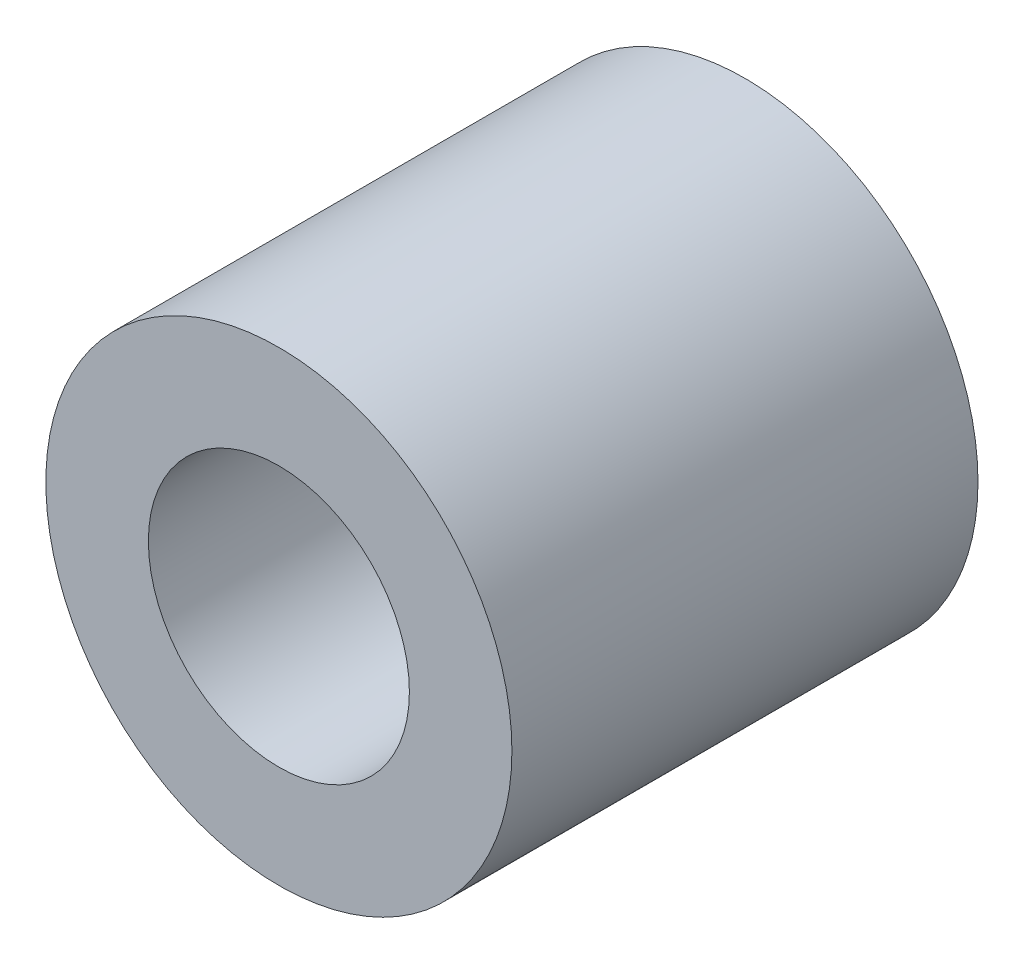
ISO-10303-21;
HEADER;
FILE_DESCRIPTION(('STEP AP214'),'2;1');
FILE_NAME('part.step','',(''),(''),'','','');
FILE_SCHEMA(('AUTOMOTIVE_DESIGN { 1 0 10303 214 1 1 1 1 }'));
ENDSEC;
DATA;
#1=APPLICATION_CONTEXT('core data for automotive mechanical design processes');
#2=APPLICATION_PROTOCOL_DEFINITION('international standard','automotive_design',2000,#1);
#3=PRODUCT_CONTEXT('',#1,'mechanical');
#4=PRODUCT('Part','Part','',(#3));
#5=PRODUCT_RELATED_PRODUCT_CATEGORY('part','',(#4));
#6=PRODUCT_DEFINITION_FORMATION('','',#4);
#7=PRODUCT_DEFINITION_CONTEXT('part definition',#1,'design');
#8=PRODUCT_DEFINITION('design','',#6,#7);
#9=PRODUCT_DEFINITION_SHAPE('','',#8);
#10=(LENGTH_UNIT() NAMED_UNIT(*) SI_UNIT(.MILLI.,.METRE.));
#11=(NAMED_UNIT(*) PLANE_ANGLE_UNIT() SI_UNIT($,.RADIAN.));
#12=(NAMED_UNIT(*) SI_UNIT($,.STERADIAN.) SOLID_ANGLE_UNIT());
#13=UNCERTAINTY_MEASURE_WITH_UNIT(LENGTH_MEASURE(1.E-05),#10,'distance_accuracy_value','');
#14=(GEOMETRIC_REPRESENTATION_CONTEXT(3) GLOBAL_UNCERTAINTY_ASSIGNED_CONTEXT((#13)) GLOBAL_UNIT_ASSIGNED_CONTEXT((#10,
#11,#12)) REPRESENTATION_CONTEXT('',''));
#15=CARTESIAN_POINT('',(0.,0.,0.));
#16=DIRECTION('',(0.,0.,1.));
#17=DIRECTION('',(1.,0.,0.));
#18=AXIS2_PLACEMENT_3D('',#15,#16,#17);
#19=CARTESIAN_POINT('',(0.,0.,3.175));
#20=DIRECTION('',(0.,0.,1.));
#21=DIRECTION('',(1.,0.,0.));
#22=AXIS2_PLACEMENT_3D('',#19,#20,#21);
#23=PLANE('',#22);
#24=CARTESIAN_POINT('',(0.,0.,3.175));
#25=DIRECTION('',(0.,0.,1.));
#26=DIRECTION('',(1.,0.,0.));
#27=AXIS2_PLACEMENT_3D('',#24,#25,#26);
#28=CIRCLE('',#27,3.175);
#29=CARTESIAN_POINT('',(3.175,0.,3.175));
#30=VERTEX_POINT('',#29);
#31=EDGE_CURVE('E10',#30,#30,#28,.T.);
#32=ORIENTED_EDGE('',*,*,#31,.T.);
#33=EDGE_LOOP('',(#32));
#34=FACE_BOUND('',#33,.T.);
#35=CARTESIAN_POINT('',(0.,0.,3.175));
#36=DIRECTION('',(0.,0.,1.));
#37=DIRECTION('',(1.,0.,0.));
#38=AXIS2_PLACEMENT_3D('',#35,#36,#37);
#39=CIRCLE('',#38,1.778);
#40=CARTESIAN_POINT('',(1.778,0.,3.175));
#41=VERTEX_POINT('',#40);
#42=EDGE_CURVE('E43',#41,#41,#39,.T.);
#43=ORIENTED_EDGE('',*,*,#42,.F.);
#44=EDGE_LOOP('',(#43));
#45=FACE_BOUND('',#44,.T.);
#46=ADVANCED_FACE('F32',(#34,#45),#23,.T.);
#47=CARTESIAN_POINT('',(0.,0.,-3.175));
#48=DIRECTION('',(0.,0.,1.));
#49=DIRECTION('',(1.,0.,0.));
#50=AXIS2_PLACEMENT_3D('',#47,#48,#49);
#51=PLANE('',#50);
#52=CARTESIAN_POINT('',(0.,0.,-3.175));
#53=DIRECTION('',(0.,0.,1.));
#54=DIRECTION('',(1.,0.,0.));
#55=AXIS2_PLACEMENT_3D('',#52,#53,#54);
#56=CIRCLE('',#55,3.175);
#57=CARTESIAN_POINT('',(3.175,0.,-3.175));
#58=VERTEX_POINT('',#57);
#59=EDGE_CURVE('E36',#58,#58,#56,.T.);
#60=ORIENTED_EDGE('',*,*,#59,.F.);
#61=EDGE_LOOP('',(#60));
#62=FACE_BOUND('',#61,.T.);
#63=CARTESIAN_POINT('',(0.,0.,-3.175));
#64=DIRECTION('',(0.,0.,1.));
#65=DIRECTION('',(1.,0.,0.));
#66=AXIS2_PLACEMENT_3D('',#63,#64,#65);
#67=CIRCLE('',#66,1.778);
#68=CARTESIAN_POINT('',(1.778,0.,-3.175));
#69=VERTEX_POINT('',#68);
#70=EDGE_CURVE('E45',#69,#69,#67,.T.);
#71=ORIENTED_EDGE('',*,*,#70,.T.);
#72=EDGE_LOOP('',(#71));
#73=FACE_BOUND('',#72,.T.);
#74=ADVANCED_FACE('F55',(#62,#73),#51,.F.);
#75=CARTESIAN_POINT('',(0.,0.,3.175));
#76=DIRECTION('',(0.,0.,-1.));
#77=DIRECTION('',(-1.,0.,0.));
#78=AXIS2_PLACEMENT_3D('',#75,#76,#77);
#79=CYLINDRICAL_SURFACE('',#78,3.175);
#80=ORIENTED_EDGE('',*,*,#31,.F.);
#81=EDGE_LOOP('',(#80));
#82=FACE_BOUND('',#81,.T.);
#83=ORIENTED_EDGE('',*,*,#59,.T.);
#84=EDGE_LOOP('',(#83));
#85=FACE_BOUND('',#84,.T.);
#86=ADVANCED_FACE('F34',(#82,#85),#79,.T.);
#87=CARTESIAN_POINT('',(0.,0.,3.175));
#88=DIRECTION('',(0.,0.,-1.));
#89=DIRECTION('',(-1.,0.,0.));
#90=AXIS2_PLACEMENT_3D('',#87,#88,#89);
#91=CYLINDRICAL_SURFACE('',#90,1.778);
#92=ORIENTED_EDGE('',*,*,#42,.T.);
#93=EDGE_LOOP('',(#92));
#94=FACE_BOUND('',#93,.T.);
#95=ORIENTED_EDGE('',*,*,#70,.F.);
#96=EDGE_LOOP('',(#95));
#97=FACE_BOUND('',#96,.T.);
#98=ADVANCED_FACE('F51',(#94,#97),#91,.F.);
#99=CLOSED_SHELL('',(#46,#74,#86,#98));
#100=MANIFOLD_SOLID_BREP('B2',#99);
#101=ADVANCED_BREP_SHAPE_REPRESENTATION('',(#18,#100),#14);
#102=SHAPE_DEFINITION_REPRESENTATION(#9,#101);
ENDSEC;
END-ISO-10303-21;
